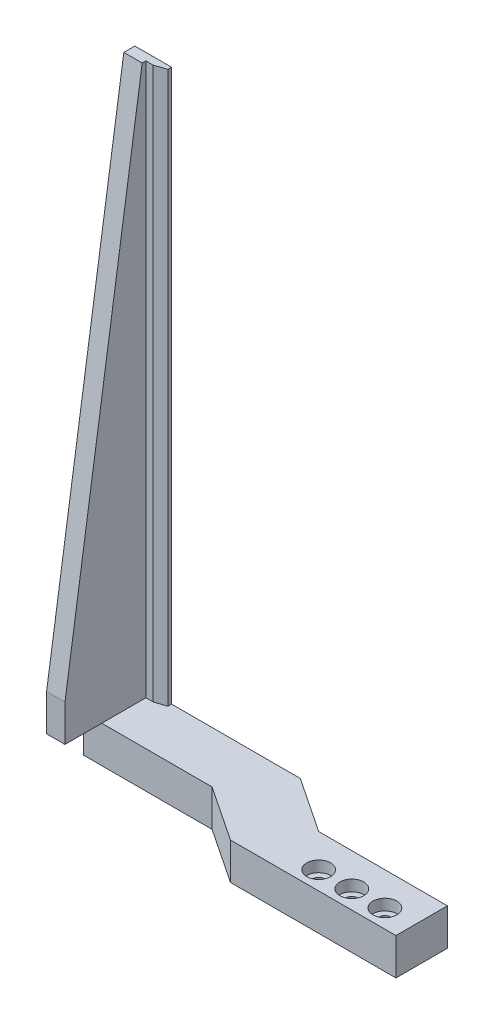
ISO-10303-21;
HEADER;
FILE_DESCRIPTION(('STEP AP214'),'2;1');
FILE_NAME('part.step','',(''),(''),'','','');
FILE_SCHEMA(('AUTOMOTIVE_DESIGN { 1 0 10303 214 1 1 1 1 }'));
ENDSEC;
DATA;
#1=APPLICATION_CONTEXT('core data for automotive mechanical design processes');
#2=APPLICATION_PROTOCOL_DEFINITION('international standard','automotive_design',2000,#1);
#3=PRODUCT_CONTEXT('',#1,'mechanical');
#4=PRODUCT('Part','Part','',(#3));
#5=PRODUCT_RELATED_PRODUCT_CATEGORY('part','',(#4));
#6=PRODUCT_DEFINITION_FORMATION('','',#4);
#7=PRODUCT_DEFINITION_CONTEXT('part definition',#1,'design');
#8=PRODUCT_DEFINITION('design','',#6,#7);
#9=PRODUCT_DEFINITION_SHAPE('','',#8);
#10=(LENGTH_UNIT() NAMED_UNIT(*) SI_UNIT(.MILLI.,.METRE.));
#11=(NAMED_UNIT(*) PLANE_ANGLE_UNIT() SI_UNIT($,.RADIAN.));
#12=(NAMED_UNIT(*) SI_UNIT($,.STERADIAN.) SOLID_ANGLE_UNIT());
#13=UNCERTAINTY_MEASURE_WITH_UNIT(LENGTH_MEASURE(1.E-05),#10,'distance_accuracy_value','');
#14=(GEOMETRIC_REPRESENTATION_CONTEXT(3) GLOBAL_UNCERTAINTY_ASSIGNED_CONTEXT((#13)) GLOBAL_UNIT_ASSIGNED_CONTEXT((#10,
#11,#12)) REPRESENTATION_CONTEXT('',''));
#15=CARTESIAN_POINT('',(0.,0.,0.));
#16=DIRECTION('',(0.,0.,1.));
#17=DIRECTION('',(1.,0.,0.));
#18=AXIS2_PLACEMENT_3D('',#15,#16,#17);
#19=CARTESIAN_POINT('',(0.,0.,24.));
#20=DIRECTION('',(0.,0.,1.));
#21=DIRECTION('',(1.,0.,0.));
#22=AXIS2_PLACEMENT_3D('',#19,#20,#21);
#23=PLANE('',#22);
#24=DIRECTION('',(0.,-1.,0.));
#25=VECTOR('',#24,1.);
#26=CARTESIAN_POINT('',(-105.,160.,24.));
#27=LINE('',#26,#25);
#28=CARTESIAN_POINT('',(-105.,20.,24.));
#29=VERTEX_POINT('',#28);
#30=CARTESIAN_POINT('',(-105.,9.99999999999999,24.));
#31=VERTEX_POINT('',#30);
#32=EDGE_CURVE('E230',#29,#31,#27,.T.);
#33=ORIENTED_EDGE('',*,*,#32,.T.);
#34=DIRECTION('',(1.,0.,0.));
#35=VECTOR('',#34,1.);
#36=CARTESIAN_POINT('',(-105.,9.99999999999999,24.));
#37=LINE('',#36,#35);
#38=CARTESIAN_POINT('',(-100.,10.,24.));
#39=VERTEX_POINT('',#38);
#40=EDGE_CURVE('E283',#31,#39,#37,.T.);
#41=ORIENTED_EDGE('',*,*,#40,.T.);
#42=DIRECTION('',(0.,1.,0.));
#43=VECTOR('',#42,1.);
#44=CARTESIAN_POINT('',(-100.,160.,24.));
#45=LINE('',#44,#43);
#46=CARTESIAN_POINT('',(-100.,20.,24.));
#47=VERTEX_POINT('',#46);
#48=EDGE_CURVE('E239',#39,#47,#45,.T.);
#49=ORIENTED_EDGE('',*,*,#48,.T.);
#50=DIRECTION('',(-1.,0.,0.));
#51=VECTOR('',#50,1.);
#52=CARTESIAN_POINT('',(-9.99899999999998,20.,24.));
#53=LINE('',#52,#51);
#54=EDGE_CURVE('E224',#47,#29,#53,.T.);
#55=ORIENTED_EDGE('',*,*,#54,.T.);
#56=EDGE_LOOP('',(#33,#41,#49,#55));
#57=FACE_BOUND('',#56,.T.);
#58=ADVANCED_FACE('F39',(#57),#23,.T.);
#59=CARTESIAN_POINT('',(-36.,-0.000999999999999265,19.));
#60=DIRECTION('',(0.,1.,0.));
#61=DIRECTION('',(0.,0.,1.));
#62=AXIS2_PLACEMENT_3D('',#59,#60,#61);
#63=CYLINDRICAL_SURFACE('',#62,1.7);
#64=CARTESIAN_POINT('',(-36.,0.,19.));
#65=DIRECTION('',(0.,1.,0.));
#66=DIRECTION('',(-1.,0.,0.));
#67=AXIS2_PLACEMENT_3D('',#64,#65,#66);
#68=CIRCLE('',#67,1.7);
#69=CARTESIAN_POINT('',(-37.7,0.,19.));
#70=VERTEX_POINT('',#69);
#71=EDGE_CURVE('E207',#70,#70,#68,.F.);
#72=ORIENTED_EDGE('',*,*,#71,.T.);
#73=EDGE_LOOP('',(#72));
#74=FACE_BOUND('',#73,.T.);
#75=CARTESIAN_POINT('',(-36.,7.,19.));
#76=DIRECTION('',(0.,1.,0.));
#77=DIRECTION('',(-1.,0.,0.));
#78=AXIS2_PLACEMENT_3D('',#75,#76,#77);
#79=CIRCLE('',#78,1.7);
#80=CARTESIAN_POINT('',(-37.7,7.,19.));
#81=VERTEX_POINT('',#80);
#82=EDGE_CURVE('E44',#81,#81,#79,.F.);
#83=ORIENTED_EDGE('',*,*,#82,.F.);
#84=EDGE_LOOP('',(#83));
#85=FACE_BOUND('',#84,.T.);
#86=ADVANCED_FACE('F337',(#74,#85),#63,.F.);
#87=CARTESIAN_POINT('',(-27.,-0.000999999999999265,19.));
#88=DIRECTION('',(0.,1.,0.));
#89=DIRECTION('',(0.,0.,1.));
#90=AXIS2_PLACEMENT_3D('',#87,#88,#89);
#91=CYLINDRICAL_SURFACE('',#90,1.7);
#92=CARTESIAN_POINT('',(-27.,0.,19.));
#93=DIRECTION('',(0.,1.,0.));
#94=DIRECTION('',(-1.,0.,0.));
#95=AXIS2_PLACEMENT_3D('',#92,#93,#94);
#96=CIRCLE('',#95,1.7);
#97=CARTESIAN_POINT('',(-28.7,0.,19.));
#98=VERTEX_POINT('',#97);
#99=EDGE_CURVE('E211',#98,#98,#96,.F.);
#100=ORIENTED_EDGE('',*,*,#99,.T.);
#101=EDGE_LOOP('',(#100));
#102=FACE_BOUND('',#101,.T.);
#103=CARTESIAN_POINT('',(-27.,7.,19.));
#104=DIRECTION('',(0.,1.,0.));
#105=DIRECTION('',(-1.,0.,0.));
#106=AXIS2_PLACEMENT_3D('',#103,#104,#105);
#107=CIRCLE('',#106,1.7);
#108=CARTESIAN_POINT('',(-28.7,7.,19.));
#109=VERTEX_POINT('',#108);
#110=EDGE_CURVE('E201',#109,#109,#107,.F.);
#111=ORIENTED_EDGE('',*,*,#110,.F.);
#112=EDGE_LOOP('',(#111));
#113=FACE_BOUND('',#112,.T.);
#114=ADVANCED_FACE('F334',(#102,#113),#91,.F.);
#115=CARTESIAN_POINT('',(-18.,-0.000999999999999265,19.));
#116=DIRECTION('',(0.,1.,0.));
#117=DIRECTION('',(0.,0.,1.));
#118=AXIS2_PLACEMENT_3D('',#115,#116,#117);
#119=CYLINDRICAL_SURFACE('',#118,1.7);
#120=CARTESIAN_POINT('',(-18.,0.,19.));
#121=DIRECTION('',(0.,1.,0.));
#122=DIRECTION('',(-1.,0.,0.));
#123=AXIS2_PLACEMENT_3D('',#120,#121,#122);
#124=CIRCLE('',#123,1.7);
#125=CARTESIAN_POINT('',(-19.7,0.,19.));
#126=VERTEX_POINT('',#125);
#127=EDGE_CURVE('E216',#126,#126,#124,.F.);
#128=ORIENTED_EDGE('',*,*,#127,.T.);
#129=EDGE_LOOP('',(#128));
#130=FACE_BOUND('',#129,.T.);
#131=CARTESIAN_POINT('',(-18.,7.,19.));
#132=DIRECTION('',(0.,1.,0.));
#133=DIRECTION('',(-1.,0.,0.));
#134=AXIS2_PLACEMENT_3D('',#131,#132,#133);
#135=CIRCLE('',#134,1.7);
#136=CARTESIAN_POINT('',(-19.7,7.,19.));
#137=VERTEX_POINT('',#136);
#138=EDGE_CURVE('E199',#137,#137,#135,.F.);
#139=ORIENTED_EDGE('',*,*,#138,.F.);
#140=EDGE_LOOP('',(#139));
#141=FACE_BOUND('',#140,.T.);
#142=ADVANCED_FACE('F323',(#130,#141),#119,.F.);
#143=CARTESIAN_POINT('',(-9.99999999999999,0.,2.));
#144=DIRECTION('',(-1.,0.,0.));
#145=DIRECTION('',(0.,-1.,0.));
#146=AXIS2_PLACEMENT_3D('',#143,#144,#145);
#147=PLANE('',#146);
#148=DIRECTION('',(0.,0.,-1.));
#149=VECTOR('',#148,1.);
#150=CARTESIAN_POINT('',(-9.99999999999999,0.,2.));
#151=LINE('',#150,#149);
#152=CARTESIAN_POINT('',(-9.99999999999999,0.,24.));
#153=VERTEX_POINT('',#152);
#154=CARTESIAN_POINT('',(-9.99999999999999,0.,10.));
#155=VERTEX_POINT('',#154);
#156=EDGE_CURVE('E168',#153,#155,#151,.T.);
#157=ORIENTED_EDGE('',*,*,#156,.T.);
#158=DIRECTION('',(0.,1.,0.));
#159=VECTOR('',#158,1.);
#160=CARTESIAN_POINT('',(-9.99999999999999,-0.000999999999999265,10.));
#161=LINE('',#160,#159);
#162=CARTESIAN_POINT('',(-9.99999999999999,10.,10.));
#163=VERTEX_POINT('',#162);
#164=EDGE_CURVE('E152',#155,#163,#161,.T.);
#165=ORIENTED_EDGE('',*,*,#164,.T.);
#166=DIRECTION('',(0.,0.,-1.));
#167=VECTOR('',#166,1.);
#168=CARTESIAN_POINT('',(-10.,10.,2.));
#169=LINE('',#168,#167);
#170=CARTESIAN_POINT('',(-9.99999999999999,10.,24.));
#171=VERTEX_POINT('',#170);
#172=EDGE_CURVE('E190',#171,#163,#169,.T.);
#173=ORIENTED_EDGE('',*,*,#172,.F.);
#174=DIRECTION('',(0.,1.,0.));
#175=VECTOR('',#174,1.);
#176=CARTESIAN_POINT('',(-9.99999999999999,10.,24.));
#177=LINE('',#176,#175);
#178=EDGE_CURVE('E174',#153,#171,#177,.T.);
#179=ORIENTED_EDGE('',*,*,#178,.F.);
#180=EDGE_LOOP('',(#157,#165,#173,#179));
#181=FACE_BOUND('',#180,.T.);
#182=ADVANCED_FACE('F172',(#181),#147,.F.);
#183=CARTESIAN_POINT('',(-10.,10.,2.));
#184=DIRECTION('',(0.,-1.,0.));
#185=DIRECTION('',(1.,0.,0.));
#186=AXIS2_PLACEMENT_3D('',#183,#184,#185);
#187=PLANE('',#186);
#188=CARTESIAN_POINT('',(-18.,10.,19.));
#189=DIRECTION('',(0.,1.,0.));
#190=DIRECTION('',(-1.,0.,0.));
#191=AXIS2_PLACEMENT_3D('',#188,#189,#190);
#192=CIRCLE('',#191,3.25);
#193=CARTESIAN_POINT('',(-21.25,10.,19.));
#194=VERTEX_POINT('',#193);
#195=EDGE_CURVE('E307',#194,#194,#192,.T.);
#196=ORIENTED_EDGE('',*,*,#195,.F.);
#197=EDGE_LOOP('',(#196));
#198=FACE_BOUND('',#197,.T.);
#199=CARTESIAN_POINT('',(-27.,10.,19.));
#200=DIRECTION('',(0.,1.,0.));
#201=DIRECTION('',(-1.,0.,0.));
#202=AXIS2_PLACEMENT_3D('',#199,#200,#201);
#203=CIRCLE('',#202,3.25);
#204=CARTESIAN_POINT('',(-30.25,10.,19.));
#205=VERTEX_POINT('',#204);
#206=EDGE_CURVE('E313',#205,#205,#203,.T.);
#207=ORIENTED_EDGE('',*,*,#206,.F.);
#208=EDGE_LOOP('',(#207));
#209=FACE_BOUND('',#208,.T.);
#210=CARTESIAN_POINT('',(-36.,10.,19.));
#211=DIRECTION('',(0.,1.,0.));
#212=DIRECTION('',(-1.,0.,0.));
#213=AXIS2_PLACEMENT_3D('',#210,#211,#212);
#214=CIRCLE('',#213,3.25);
#215=CARTESIAN_POINT('',(-39.25,10.,19.));
#216=VERTEX_POINT('',#215);
#217=EDGE_CURVE('E276',#216,#216,#214,.T.);
#218=ORIENTED_EDGE('',*,*,#217,.F.);
#219=EDGE_LOOP('',(#218));
#220=FACE_BOUND('',#219,.T.);
#221=ORIENTED_EDGE('',*,*,#172,.T.);
#222=DIRECTION('',(1.,0.,0.));
#223=VECTOR('',#222,1.);
#224=CARTESIAN_POINT('',(-9.99999999999999,10.,10.));
#225=LINE('',#224,#223);
#226=CARTESIAN_POINT('',(-45.,10.,10.));
#227=VERTEX_POINT('',#226);
#228=EDGE_CURVE('E157',#227,#163,#225,.T.);
#229=ORIENTED_EDGE('',*,*,#228,.F.);
#230=DIRECTION('',(0.832050294337843,0.,0.554700196225229));
#231=VECTOR('',#230,1.);
#232=CARTESIAN_POINT('',(-45.,10.,10.));
#233=LINE('',#232,#231);
#234=CARTESIAN_POINT('',(-60.,9.99999999999999,0.));
#235=VERTEX_POINT('',#234);
#236=EDGE_CURVE('E162',#235,#227,#233,.T.);
#237=ORIENTED_EDGE('',*,*,#236,.F.);
#238=DIRECTION('',(-1.,0.,0.));
#239=VECTOR('',#238,1.);
#240=CARTESIAN_POINT('',(-10.,10.,0.));
#241=LINE('',#240,#239);
#242=CARTESIAN_POINT('',(-95.,9.99999999999999,0.));
#243=VERTEX_POINT('',#242);
#244=EDGE_CURVE('E252',#235,#243,#241,.T.);
#245=ORIENTED_EDGE('',*,*,#244,.T.);
#246=DIRECTION('',(0.,0.,-1.));
#247=VECTOR('',#246,1.);
#248=CARTESIAN_POINT('',(-95.,9.99999999999999,2.));
#249=LINE('',#248,#247);
#250=CARTESIAN_POINT('',(-95.,9.99999999999999,0.999999999999999));
#251=VERTEX_POINT('',#250);
#252=EDGE_CURVE('E188',#251,#243,#249,.T.);
#253=ORIENTED_EDGE('',*,*,#252,.F.);
#254=DIRECTION('',(-0.948683298050515,0.,0.316227766016835));
#255=VECTOR('',#254,1.);
#256=CARTESIAN_POINT('',(-18.7999999999999,10.,-24.3999999999998));
#257=LINE('',#256,#255);
#258=CARTESIAN_POINT('',(-98.,10.,2.));
#259=VERTEX_POINT('',#258);
#260=EDGE_CURVE('E11',#251,#259,#257,.T.);
#261=ORIENTED_EDGE('',*,*,#260,.T.);
#262=DIRECTION('',(-1.,0.,0.));
#263=VECTOR('',#262,1.);
#264=CARTESIAN_POINT('',(-100.,10.,2.));
#265=LINE('',#264,#263);
#266=CARTESIAN_POINT('',(-100.,10.,2.));
#267=VERTEX_POINT('',#266);
#268=EDGE_CURVE('E192',#259,#267,#265,.T.);
#269=ORIENTED_EDGE('',*,*,#268,.T.);
#270=DIRECTION('',(0.,0.,-1.));
#271=VECTOR('',#270,1.);
#272=CARTESIAN_POINT('',(-100.,10.,24.));
#273=LINE('',#272,#271);
#274=CARTESIAN_POINT('',(-100.,9.99999999999999,14.));
#275=VERTEX_POINT('',#274);
#276=EDGE_CURVE('E249',#275,#267,#273,.T.);
#277=ORIENTED_EDGE('',*,*,#276,.F.);
#278=DIRECTION('',(-1.,0.,0.));
#279=VECTOR('',#278,1.);
#280=CARTESIAN_POINT('',(-70.,9.99999999999999,14.));
#281=LINE('',#280,#279);
#282=CARTESIAN_POINT('',(-70.,9.99999999999999,14.));
#283=VERTEX_POINT('',#282);
#284=EDGE_CURVE('E290',#283,#275,#281,.T.);
#285=ORIENTED_EDGE('',*,*,#284,.F.);
#286=DIRECTION('',(-0.832050294337843,0.,-0.554700196225229));
#287=VECTOR('',#286,1.);
#288=CARTESIAN_POINT('',(-55.,10.,24.));
#289=LINE('',#288,#287);
#290=CARTESIAN_POINT('',(-55.,10.,24.));
#291=VERTEX_POINT('',#290);
#292=EDGE_CURVE('E286',#291,#283,#289,.T.);
#293=ORIENTED_EDGE('',*,*,#292,.F.);
#294=DIRECTION('',(-1.,0.,0.));
#295=VECTOR('',#294,1.);
#296=CARTESIAN_POINT('',(-100.,10.,24.));
#297=LINE('',#296,#295);
#298=EDGE_CURVE('E236',#171,#291,#297,.T.);
#299=ORIENTED_EDGE('',*,*,#298,.F.);
#300=EDGE_LOOP('',(#221,#229,#237,#245,#253,#261,#269,#277,#285,#293,#299));
#301=FACE_BOUND('',#300,.T.);
#302=ADVANCED_FACE('F388',(#198,#209,#220,#301),#187,.F.);
#303=CARTESIAN_POINT('',(-95.,9.99999999999999,2.));
#304=DIRECTION('',(-1.,0.,0.));
#305=DIRECTION('',(0.,0.,1.));
#306=AXIS2_PLACEMENT_3D('',#303,#304,#305);
#307=PLANE('',#306);
#308=DIRECTION('',(0.,0.,-1.));
#309=VECTOR('',#308,1.);
#310=CARTESIAN_POINT('',(-95.,160.,2.));
#311=LINE('',#310,#309);
#312=CARTESIAN_POINT('',(-95.,160.,0.999999999999999));
#313=VERTEX_POINT('',#312);
#314=CARTESIAN_POINT('',(-95.,160.,0.));
#315=VERTEX_POINT('',#314);
#316=EDGE_CURVE('E186',#313,#315,#311,.T.);
#317=ORIENTED_EDGE('',*,*,#316,.F.);
#318=DIRECTION('',(0.,-1.,0.));
#319=VECTOR('',#318,1.);
#320=CARTESIAN_POINT('',(-95.,9.99999999999999,0.999999999999999));
#321=LINE('',#320,#319);
#322=EDGE_CURVE('E49',#313,#251,#321,.T.);
#323=ORIENTED_EDGE('',*,*,#322,.T.);
#324=ORIENTED_EDGE('',*,*,#252,.T.);
#325=DIRECTION('',(0.,1.,0.));
#326=VECTOR('',#325,1.);
#327=CARTESIAN_POINT('',(-95.,9.99999999999999,0.));
#328=LINE('',#327,#326);
#329=EDGE_CURVE('E255',#243,#315,#328,.T.);
#330=ORIENTED_EDGE('',*,*,#329,.T.);
#331=EDGE_LOOP('',(#317,#323,#324,#330));
#332=FACE_BOUND('',#331,.T.);
#333=ADVANCED_FACE('F385',(#332),#307,.F.);
#334=CARTESIAN_POINT('',(-95.,160.,2.));
#335=DIRECTION('',(0.,-1.,0.));
#336=DIRECTION('',(0.,0.,-1.));
#337=AXIS2_PLACEMENT_3D('',#334,#335,#336);
#338=PLANE('',#337);
#339=DIRECTION('',(-1.,0.,0.));
#340=VECTOR('',#339,1.);
#341=CARTESIAN_POINT('',(-95.,160.,2.));
#342=LINE('',#341,#340);
#343=CARTESIAN_POINT('',(-98.,160.,2.));
#344=VERTEX_POINT('',#343);
#345=CARTESIAN_POINT('',(-100.,160.,2.));
#346=VERTEX_POINT('',#345);
#347=EDGE_CURVE('E176',#344,#346,#342,.T.);
#348=ORIENTED_EDGE('',*,*,#347,.F.);
#349=DIRECTION('',(0.948683298050515,0.,-0.316227766016835));
#350=VECTOR('',#349,1.);
#351=CARTESIAN_POINT('',(-98.,160.,2.));
#352=LINE('',#351,#350);
#353=EDGE_CURVE('E196',#344,#313,#352,.T.);
#354=ORIENTED_EDGE('',*,*,#353,.T.);
#355=ORIENTED_EDGE('',*,*,#316,.T.);
#356=DIRECTION('',(-1.,0.,0.));
#357=VECTOR('',#356,1.);
#358=CARTESIAN_POINT('',(-95.,160.,0.));
#359=LINE('',#358,#357);
#360=CARTESIAN_POINT('',(-105.,160.,0.));
#361=VERTEX_POINT('',#360);
#362=EDGE_CURVE('E258',#315,#361,#359,.T.);
#363=ORIENTED_EDGE('',*,*,#362,.T.);
#364=DIRECTION('',(0.,0.,-1.));
#365=VECTOR('',#364,1.);
#366=CARTESIAN_POINT('',(-105.,160.,2.));
#367=LINE('',#366,#365);
#368=CARTESIAN_POINT('',(-105.,160.,3.));
#369=VERTEX_POINT('',#368);
#370=EDGE_CURVE('E178',#369,#361,#367,.T.);
#371=ORIENTED_EDGE('',*,*,#370,.F.);
#372=DIRECTION('',(-1.,0.,0.));
#373=VECTOR('',#372,1.);
#374=CARTESIAN_POINT('',(-9.99899999999999,160.,3.));
#375=LINE('',#374,#373);
#376=CARTESIAN_POINT('',(-100.,160.,3.));
#377=VERTEX_POINT('',#376);
#378=EDGE_CURVE('E225',#377,#369,#375,.T.);
#379=ORIENTED_EDGE('',*,*,#378,.F.);
#380=DIRECTION('',(0.,0.,-1.));
#381=VECTOR('',#380,1.);
#382=CARTESIAN_POINT('',(-100.,160.,24.));
#383=LINE('',#382,#381);
#384=EDGE_CURVE('E242',#377,#346,#383,.T.);
#385=ORIENTED_EDGE('',*,*,#384,.T.);
#386=EDGE_LOOP('',(#348,#354,#355,#363,#371,#379,#385));
#387=FACE_BOUND('',#386,.T.);
#388=ADVANCED_FACE('F383',(#387),#338,.F.);
#389=CARTESIAN_POINT('',(-105.,160.,2.));
#390=DIRECTION('',(1.,0.,0.));
#391=DIRECTION('',(0.,1.,0.));
#392=AXIS2_PLACEMENT_3D('',#389,#390,#391);
#393=PLANE('',#392);
#394=DIRECTION('',(0.,0.,-1.));
#395=VECTOR('',#394,1.);
#396=CARTESIAN_POINT('',(-105.,0.,2.));
#397=LINE('',#396,#395);
#398=CARTESIAN_POINT('',(-105.,0.,14.));
#399=VERTEX_POINT('',#398);
#400=CARTESIAN_POINT('',(-105.,0.,0.));
#401=VERTEX_POINT('',#400);
#402=EDGE_CURVE('E175',#399,#401,#397,.T.);
#403=ORIENTED_EDGE('',*,*,#402,.F.);
#404=DIRECTION('',(0.,1.,0.));
#405=VECTOR('',#404,1.);
#406=CARTESIAN_POINT('',(-105.,-0.00100000000000794,14.));
#407=LINE('',#406,#405);
#408=CARTESIAN_POINT('',(-105.,9.99999999999999,14.));
#409=VERTEX_POINT('',#408);
#410=EDGE_CURVE('E297',#399,#409,#407,.T.);
#411=ORIENTED_EDGE('',*,*,#410,.T.);
#412=DIRECTION('',(0.,0.,1.));
#413=VECTOR('',#412,1.);
#414=CARTESIAN_POINT('',(-105.,9.99999999999999,14.));
#415=LINE('',#414,#413);
#416=EDGE_CURVE('E293',#409,#31,#415,.T.);
#417=ORIENTED_EDGE('',*,*,#416,.T.);
#418=ORIENTED_EDGE('',*,*,#32,.F.);
#419=DIRECTION('',(0.,-0.988936352868298,0.148340452930245));
#420=VECTOR('',#419,1.);
#421=CARTESIAN_POINT('',(-105.,20.,24.));
#422=LINE('',#421,#420);
#423=EDGE_CURVE('E222',#369,#29,#422,.T.);
#424=ORIENTED_EDGE('',*,*,#423,.F.);
#425=ORIENTED_EDGE('',*,*,#370,.T.);
#426=DIRECTION('',(0.,-1.,0.));
#427=VECTOR('',#426,1.);
#428=CARTESIAN_POINT('',(-105.,160.,0.));
#429=LINE('',#428,#427);
#430=EDGE_CURVE('E260',#361,#401,#429,.T.);
#431=ORIENTED_EDGE('',*,*,#430,.T.);
#432=EDGE_LOOP('',(#403,#411,#417,#418,#424,#425,#431));
#433=FACE_BOUND('',#432,.T.);
#434=ADVANCED_FACE('F329',(#433),#393,.F.);
#435=CARTESIAN_POINT('',(-105.,0.,2.));
#436=DIRECTION('',(0.,1.,0.));
#437=DIRECTION('',(-1.,0.,0.));
#438=AXIS2_PLACEMENT_3D('',#435,#436,#437);
#439=PLANE('',#438);
#440=ORIENTED_EDGE('',*,*,#127,.F.);
#441=EDGE_LOOP('',(#440));
#442=FACE_BOUND('',#441,.T.);
#443=ORIENTED_EDGE('',*,*,#99,.F.);
#444=EDGE_LOOP('',(#443));
#445=FACE_BOUND('',#444,.T.);
#446=ORIENTED_EDGE('',*,*,#71,.F.);
#447=EDGE_LOOP('',(#446));
#448=FACE_BOUND('',#447,.T.);
#449=DIRECTION('',(-0.832050294337843,0.,-0.554700196225229));
#450=VECTOR('',#449,1.);
#451=CARTESIAN_POINT('',(-45.,0.,10.));
#452=LINE('',#451,#450);
#453=CARTESIAN_POINT('',(-45.,0.,10.));
#454=VERTEX_POINT('',#453);
#455=CARTESIAN_POINT('',(-60.,0.,0.));
#456=VERTEX_POINT('',#455);
#457=EDGE_CURVE('E57',#454,#456,#452,.T.);
#458=ORIENTED_EDGE('',*,*,#457,.F.);
#459=DIRECTION('',(-1.,0.,0.));
#460=VECTOR('',#459,1.);
#461=CARTESIAN_POINT('',(-9.99999999999999,0.,10.));
#462=LINE('',#461,#460);
#463=EDGE_CURVE('E155',#155,#454,#462,.T.);
#464=ORIENTED_EDGE('',*,*,#463,.F.);
#465=ORIENTED_EDGE('',*,*,#156,.F.);
#466=DIRECTION('',(1.,0.,0.));
#467=VECTOR('',#466,1.);
#468=CARTESIAN_POINT('',(-105.,0.,24.));
#469=LINE('',#468,#467);
#470=CARTESIAN_POINT('',(-55.,0.,24.));
#471=VERTEX_POINT('',#470);
#472=EDGE_CURVE('E233',#471,#153,#469,.T.);
#473=ORIENTED_EDGE('',*,*,#472,.F.);
#474=DIRECTION('',(0.832050294337843,0.,0.55470019622523));
#475=VECTOR('',#474,1.);
#476=CARTESIAN_POINT('',(-55.,0.,24.));
#477=LINE('',#476,#475);
#478=CARTESIAN_POINT('',(-70.,0.,14.));
#479=VERTEX_POINT('',#478);
#480=EDGE_CURVE('E300',#479,#471,#477,.T.);
#481=ORIENTED_EDGE('',*,*,#480,.F.);
#482=DIRECTION('',(1.,0.,0.));
#483=VECTOR('',#482,1.);
#484=CARTESIAN_POINT('',(-70.,0.,14.));
#485=LINE('',#484,#483);
#486=EDGE_CURVE('E280',#399,#479,#485,.T.);
#487=ORIENTED_EDGE('',*,*,#486,.F.);
#488=ORIENTED_EDGE('',*,*,#402,.T.);
#489=DIRECTION('',(1.,0.,0.));
#490=VECTOR('',#489,1.);
#491=CARTESIAN_POINT('',(-105.,0.,0.));
#492=LINE('',#491,#490);
#493=EDGE_CURVE('E180',#401,#456,#492,.T.);
#494=ORIENTED_EDGE('',*,*,#493,.T.);
#495=EDGE_LOOP('',(#458,#464,#465,#473,#481,#487,#488,#494));
#496=FACE_BOUND('',#495,.T.);
#497=ADVANCED_FACE('F166',(#442,#445,#448,#496),#439,.F.);
#498=CARTESIAN_POINT('',(0.,0.,2.));
#499=DIRECTION('',(0.,0.,1.));
#500=DIRECTION('',(1.,0.,0.));
#501=AXIS2_PLACEMENT_3D('',#498,#499,#500);
#502=PLANE('',#501);
#503=ORIENTED_EDGE('',*,*,#268,.F.);
#504=DIRECTION('',(0.,1.,0.));
#505=VECTOR('',#504,1.);
#506=CARTESIAN_POINT('',(-98.,160.,2.));
#507=LINE('',#506,#505);
#508=EDGE_CURVE('E193',#259,#344,#507,.T.);
#509=ORIENTED_EDGE('',*,*,#508,.T.);
#510=ORIENTED_EDGE('',*,*,#347,.T.);
#511=DIRECTION('',(0.,1.,0.));
#512=VECTOR('',#511,1.);
#513=CARTESIAN_POINT('',(-100.,160.,2.));
#514=LINE('',#513,#512);
#515=EDGE_CURVE('E227',#267,#346,#514,.T.);
#516=ORIENTED_EDGE('',*,*,#515,.F.);
#517=EDGE_LOOP('',(#503,#509,#510,#516));
#518=FACE_BOUND('',#517,.T.);
#519=ADVANCED_FACE('F328',(#518),#502,.T.);
#520=CARTESIAN_POINT('',(0.,0.,0.));
#521=DIRECTION('',(0.,0.,1.));
#522=DIRECTION('',(1.,0.,0.));
#523=AXIS2_PLACEMENT_3D('',#520,#521,#522);
#524=PLANE('',#523);
#525=ORIENTED_EDGE('',*,*,#244,.F.);
#526=DIRECTION('',(0.,1.,0.));
#527=VECTOR('',#526,1.);
#528=CARTESIAN_POINT('',(-60.,-0.00100000000000447,0.));
#529=LINE('',#528,#527);
#530=EDGE_CURVE('E161',#456,#235,#529,.T.);
#531=ORIENTED_EDGE('',*,*,#530,.F.);
#532=ORIENTED_EDGE('',*,*,#493,.F.);
#533=ORIENTED_EDGE('',*,*,#430,.F.);
#534=ORIENTED_EDGE('',*,*,#362,.F.);
#535=ORIENTED_EDGE('',*,*,#329,.F.);
#536=EDGE_LOOP('',(#525,#531,#532,#533,#534,#535));
#537=FACE_BOUND('',#536,.T.);
#538=ADVANCED_FACE('F269',(#537),#524,.F.);
#539=CARTESIAN_POINT('',(-100.,160.,24.));
#540=DIRECTION('',(-1.,0.,0.));
#541=DIRECTION('',(0.,-1.,0.));
#542=AXIS2_PLACEMENT_3D('',#539,#540,#541);
#543=PLANE('',#542);
#544=ORIENTED_EDGE('',*,*,#384,.F.);
#545=DIRECTION('',(0.,0.988936352868298,-0.148340452930245));
#546=VECTOR('',#545,1.);
#547=CARTESIAN_POINT('',(-100.,20.,24.));
#548=LINE('',#547,#546);
#549=EDGE_CURVE('E220',#47,#377,#548,.T.);
#550=ORIENTED_EDGE('',*,*,#549,.F.);
#551=ORIENTED_EDGE('',*,*,#48,.F.);
#552=EDGE_CURVE('E250',#39,#275,#273,.T.);
#553=ORIENTED_EDGE('',*,*,#552,.T.);
#554=ORIENTED_EDGE('',*,*,#276,.T.);
#555=ORIENTED_EDGE('',*,*,#515,.T.);
#556=EDGE_LOOP('',(#544,#550,#551,#553,#554,#555));
#557=FACE_BOUND('',#556,.T.);
#558=ADVANCED_FACE('F355',(#557),#543,.F.);
#559=DIRECTION('',(0.,1.,0.));
#560=VECTOR('',#559,1.);
#561=CARTESIAN_POINT('',(-55.,-0.00100000000000273,24.));
#562=LINE('',#561,#560);
#563=EDGE_CURVE('E296',#471,#291,#562,.T.);
#564=ORIENTED_EDGE('',*,*,#563,.F.);
#565=ORIENTED_EDGE('',*,*,#472,.T.);
#566=ORIENTED_EDGE('',*,*,#178,.T.);
#567=ORIENTED_EDGE('',*,*,#298,.T.);
#568=EDGE_LOOP('',(#564,#565,#566,#567));
#569=FACE_BOUND('',#568,.T.);
#570=ADVANCED_FACE('F348',(#569),#23,.T.);
#571=CARTESIAN_POINT('',(-9.99899999999998,20.,24.));
#572=DIRECTION('',(0.,-0.148340452930245,-0.988936352868298));
#573=DIRECTION('',(0.,0.988936352868298,-0.148340452930245));
#574=AXIS2_PLACEMENT_3D('',#571,#572,#573);
#575=PLANE('',#574);
#576=ORIENTED_EDGE('',*,*,#549,.T.);
#577=ORIENTED_EDGE('',*,*,#378,.T.);
#578=ORIENTED_EDGE('',*,*,#423,.T.);
#579=ORIENTED_EDGE('',*,*,#54,.F.);
#580=EDGE_LOOP('',(#576,#577,#578,#579));
#581=FACE_BOUND('',#580,.T.);
#582=ADVANCED_FACE('F354',(#581),#575,.F.);
#583=CARTESIAN_POINT('',(-98.,0.,2.));
#584=DIRECTION('',(0.316227766016835,0.,0.948683298050515));
#585=DIRECTION('',(0.,-1.,0.));
#586=AXIS2_PLACEMENT_3D('',#583,#584,#585);
#587=PLANE('',#586);
#588=ORIENTED_EDGE('',*,*,#260,.F.);
#589=ORIENTED_EDGE('',*,*,#322,.F.);
#590=ORIENTED_EDGE('',*,*,#353,.F.);
#591=ORIENTED_EDGE('',*,*,#508,.F.);
#592=EDGE_LOOP('',(#588,#589,#590,#591));
#593=FACE_BOUND('',#592,.T.);
#594=ADVANCED_FACE('F42',(#593),#587,.T.);
#595=CARTESIAN_POINT('',(-18.,7.,19.));
#596=DIRECTION('',(0.,1.,0.));
#597=DIRECTION('',(-1.,0.,0.));
#598=AXIS2_PLACEMENT_3D('',#595,#596,#597);
#599=PLANE('',#598);
#600=CARTESIAN_POINT('',(-18.,7.,19.));
#601=DIRECTION('',(0.,1.,0.));
#602=DIRECTION('',(-1.,0.,0.));
#603=AXIS2_PLACEMENT_3D('',#600,#601,#602);
#604=CIRCLE('',#603,3.25);
#605=CARTESIAN_POINT('',(-21.25,7.,19.));
#606=VERTEX_POINT('',#605);
#607=EDGE_CURVE('E202',#606,#606,#604,.T.);
#608=ORIENTED_EDGE('',*,*,#607,.T.);
#609=EDGE_LOOP('',(#608));
#610=FACE_BOUND('',#609,.T.);
#611=ORIENTED_EDGE('',*,*,#138,.T.);
#612=EDGE_LOOP('',(#611));
#613=FACE_BOUND('',#612,.T.);
#614=ADVANCED_FACE('F411',(#610,#613),#599,.T.);
#615=CARTESIAN_POINT('',(-18.,7.,19.));
#616=DIRECTION('',(0.,1.,0.));
#617=DIRECTION('',(-1.,0.,0.));
#618=AXIS2_PLACEMENT_3D('',#615,#616,#617);
#619=CYLINDRICAL_SURFACE('',#618,3.25);
#620=ORIENTED_EDGE('',*,*,#607,.F.);
#621=EDGE_LOOP('',(#620));
#622=FACE_BOUND('',#621,.T.);
#623=ORIENTED_EDGE('',*,*,#195,.T.);
#624=EDGE_LOOP('',(#623));
#625=FACE_BOUND('',#624,.T.);
#626=ADVANCED_FACE('F414',(#622,#625),#619,.F.);
#627=CARTESIAN_POINT('',(-27.,7.,19.));
#628=DIRECTION('',(0.,1.,0.));
#629=DIRECTION('',(-1.,0.,0.));
#630=AXIS2_PLACEMENT_3D('',#627,#628,#629);
#631=PLANE('',#630);
#632=CARTESIAN_POINT('',(-27.,7.,19.));
#633=DIRECTION('',(0.,1.,0.));
#634=DIRECTION('',(-1.,0.,0.));
#635=AXIS2_PLACEMENT_3D('',#632,#633,#634);
#636=CIRCLE('',#635,3.25);
#637=CARTESIAN_POINT('',(-30.25,7.,19.));
#638=VERTEX_POINT('',#637);
#639=EDGE_CURVE('E310',#638,#638,#636,.T.);
#640=ORIENTED_EDGE('',*,*,#639,.T.);
#641=EDGE_LOOP('',(#640));
#642=FACE_BOUND('',#641,.T.);
#643=ORIENTED_EDGE('',*,*,#110,.T.);
#644=EDGE_LOOP('',(#643));
#645=FACE_BOUND('',#644,.T.);
#646=ADVANCED_FACE('F418',(#642,#645),#631,.T.);
#647=CARTESIAN_POINT('',(-27.,7.,19.));
#648=DIRECTION('',(0.,1.,0.));
#649=DIRECTION('',(-1.,0.,0.));
#650=AXIS2_PLACEMENT_3D('',#647,#648,#649);
#651=CYLINDRICAL_SURFACE('',#650,3.25);
#652=ORIENTED_EDGE('',*,*,#639,.F.);
#653=EDGE_LOOP('',(#652));
#654=FACE_BOUND('',#653,.T.);
#655=ORIENTED_EDGE('',*,*,#206,.T.);
#656=EDGE_LOOP('',(#655));
#657=FACE_BOUND('',#656,.T.);
#658=ADVANCED_FACE('F422',(#654,#657),#651,.F.);
#659=CARTESIAN_POINT('',(-36.,7.,19.));
#660=DIRECTION('',(0.,1.,0.));
#661=DIRECTION('',(-1.,0.,0.));
#662=AXIS2_PLACEMENT_3D('',#659,#660,#661);
#663=PLANE('',#662);
#664=CARTESIAN_POINT('',(-36.,7.,19.));
#665=DIRECTION('',(0.,1.,0.));
#666=DIRECTION('',(-1.,0.,0.));
#667=AXIS2_PLACEMENT_3D('',#664,#665,#666);
#668=CIRCLE('',#667,3.25);
#669=CARTESIAN_POINT('',(-39.25,7.,19.));
#670=VERTEX_POINT('',#669);
#671=EDGE_CURVE('E316',#670,#670,#668,.T.);
#672=ORIENTED_EDGE('',*,*,#671,.T.);
#673=EDGE_LOOP('',(#672));
#674=FACE_BOUND('',#673,.T.);
#675=ORIENTED_EDGE('',*,*,#82,.T.);
#676=EDGE_LOOP('',(#675));
#677=FACE_BOUND('',#676,.T.);
#678=ADVANCED_FACE('F403',(#674,#677),#663,.T.);
#679=CARTESIAN_POINT('',(-36.,7.,19.));
#680=DIRECTION('',(0.,1.,0.));
#681=DIRECTION('',(-1.,0.,0.));
#682=AXIS2_PLACEMENT_3D('',#679,#680,#681);
#683=CYLINDRICAL_SURFACE('',#682,3.25);
#684=ORIENTED_EDGE('',*,*,#671,.F.);
#685=EDGE_LOOP('',(#684));
#686=FACE_BOUND('',#685,.T.);
#687=ORIENTED_EDGE('',*,*,#217,.T.);
#688=EDGE_LOOP('',(#687));
#689=FACE_BOUND('',#688,.T.);
#690=ADVANCED_FACE('F396',(#686,#689),#683,.F.);
#691=CARTESIAN_POINT('',(0.,10.,0.));
#692=DIRECTION('',(0.,-1.,0.));
#693=DIRECTION('',(1.,0.,0.));
#694=AXIS2_PLACEMENT_3D('',#691,#692,#693);
#695=PLANE('',#694);
#696=ORIENTED_EDGE('',*,*,#552,.F.);
#697=ORIENTED_EDGE('',*,*,#40,.F.);
#698=ORIENTED_EDGE('',*,*,#416,.F.);
#699=EDGE_CURVE('E289',#275,#409,#281,.T.);
#700=ORIENTED_EDGE('',*,*,#699,.F.);
#701=EDGE_LOOP('',(#696,#697,#698,#700));
#702=FACE_BOUND('',#701,.T.);
#703=ADVANCED_FACE('F394',(#702),#695,.T.);
#704=CARTESIAN_POINT('',(-70.,-0.00100000000000447,14.));
#705=DIRECTION('',(0.,0.,-1.));
#706=DIRECTION('',(-1.,0.,0.));
#707=AXIS2_PLACEMENT_3D('',#704,#705,#706);
#708=PLANE('',#707);
#709=ORIENTED_EDGE('',*,*,#486,.T.);
#710=DIRECTION('',(0.,1.,0.));
#711=VECTOR('',#710,1.);
#712=CARTESIAN_POINT('',(-70.,-0.00100000000000447,14.));
#713=LINE('',#712,#711);
#714=EDGE_CURVE('E301',#479,#283,#713,.T.);
#715=ORIENTED_EDGE('',*,*,#714,.T.);
#716=ORIENTED_EDGE('',*,*,#284,.T.);
#717=ORIENTED_EDGE('',*,*,#699,.T.);
#718=ORIENTED_EDGE('',*,*,#410,.F.);
#719=EDGE_LOOP('',(#709,#715,#716,#717,#718));
#720=FACE_BOUND('',#719,.T.);
#721=ADVANCED_FACE('F371',(#720),#708,.F.);
#722=CARTESIAN_POINT('',(-55.,-0.00100000000000273,24.));
#723=DIRECTION('',(0.55470019622523,0.,-0.832050294337843));
#724=DIRECTION('',(-0.832050294337843,0.,-0.55470019622523));
#725=AXIS2_PLACEMENT_3D('',#722,#723,#724);
#726=PLANE('',#725);
#727=ORIENTED_EDGE('',*,*,#480,.T.);
#728=ORIENTED_EDGE('',*,*,#563,.T.);
#729=ORIENTED_EDGE('',*,*,#292,.T.);
#730=ORIENTED_EDGE('',*,*,#714,.F.);
#731=EDGE_LOOP('',(#727,#728,#729,#730));
#732=FACE_BOUND('',#731,.T.);
#733=ADVANCED_FACE('F368',(#732),#726,.F.);
#734=CARTESIAN_POINT('',(-9.99999999999999,-0.000999999999999265,10.));
#735=DIRECTION('',(0.,0.,1.));
#736=DIRECTION('',(1.,0.,0.));
#737=AXIS2_PLACEMENT_3D('',#734,#735,#736);
#738=PLANE('',#737);
#739=ORIENTED_EDGE('',*,*,#463,.T.);
#740=DIRECTION('',(0.,1.,0.));
#741=VECTOR('',#740,1.);
#742=CARTESIAN_POINT('',(-45.,-0.00100000000000273,10.));
#743=LINE('',#742,#741);
#744=EDGE_CURVE('E274',#454,#227,#743,.T.);
#745=ORIENTED_EDGE('',*,*,#744,.T.);
#746=ORIENTED_EDGE('',*,*,#228,.T.);
#747=ORIENTED_EDGE('',*,*,#164,.F.);
#748=EDGE_LOOP('',(#739,#745,#746,#747));
#749=FACE_BOUND('',#748,.T.);
#750=ADVANCED_FACE('F154',(#749),#738,.F.);
#751=CARTESIAN_POINT('',(-45.,-0.00100000000000273,10.));
#752=DIRECTION('',(-0.554700196225229,0.,0.832050294337843));
#753=DIRECTION('',(0.832050294337843,0.,0.554700196225229));
#754=AXIS2_PLACEMENT_3D('',#751,#752,#753);
#755=PLANE('',#754);
#756=ORIENTED_EDGE('',*,*,#457,.T.);
#757=ORIENTED_EDGE('',*,*,#530,.T.);
#758=ORIENTED_EDGE('',*,*,#236,.T.);
#759=ORIENTED_EDGE('',*,*,#744,.F.);
#760=EDGE_LOOP('',(#756,#757,#758,#759));
#761=FACE_BOUND('',#760,.T.);
#762=ADVANCED_FACE('F499',(#761),#755,.F.);
#763=CLOSED_SHELL('',(#58,#86,#114,#142,#182,#302,#333,#388,#434,#497,#519,#538,#558,#570,#582,
#594,#614,#626,#646,#658,#678,#690,#703,#721,#733,#750,#762));
#764=MANIFOLD_SOLID_BREP('B2',#763);
#765=ADVANCED_BREP_SHAPE_REPRESENTATION('',(#18,#764),#14);
#766=SHAPE_DEFINITION_REPRESENTATION(#9,#765);
ENDSEC;
END-ISO-10303-21;
